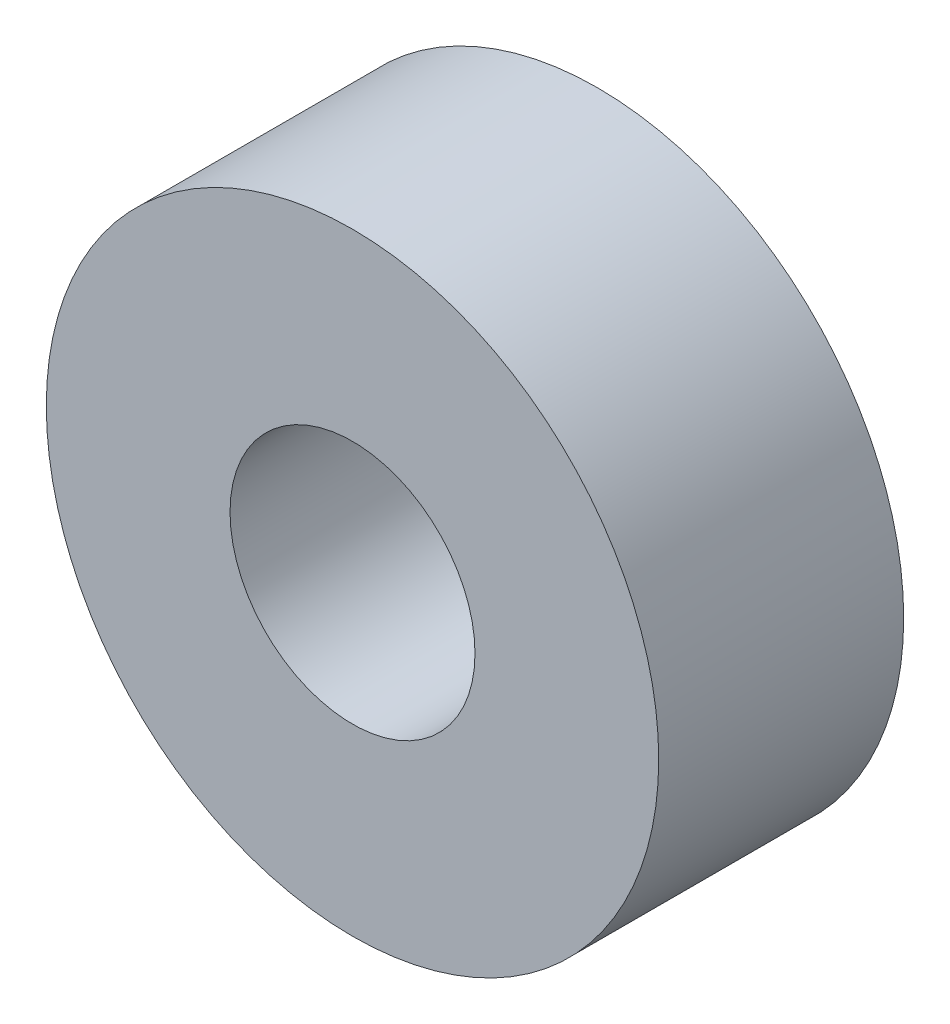
ISO-10303-21;
HEADER;
FILE_DESCRIPTION(('STEP AP214'),'2;1');
FILE_NAME('part.step','',(''),(''),'','','');
FILE_SCHEMA(('AUTOMOTIVE_DESIGN { 1 0 10303 214 1 1 1 1 }'));
ENDSEC;
DATA;
#1=APPLICATION_CONTEXT('core data for automotive mechanical design processes');
#2=APPLICATION_PROTOCOL_DEFINITION('international standard','automotive_design',2000,#1);
#3=PRODUCT_CONTEXT('',#1,'mechanical');
#4=PRODUCT('Part','Part','',(#3));
#5=PRODUCT_RELATED_PRODUCT_CATEGORY('part','',(#4));
#6=PRODUCT_DEFINITION_FORMATION('','',#4);
#7=PRODUCT_DEFINITION_CONTEXT('part definition',#1,'design');
#8=PRODUCT_DEFINITION('design','',#6,#7);
#9=PRODUCT_DEFINITION_SHAPE('','',#8);
#10=(LENGTH_UNIT() NAMED_UNIT(*) SI_UNIT(.MILLI.,.METRE.));
#11=(NAMED_UNIT(*) PLANE_ANGLE_UNIT() SI_UNIT($,.RADIAN.));
#12=(NAMED_UNIT(*) SI_UNIT($,.STERADIAN.) SOLID_ANGLE_UNIT());
#13=UNCERTAINTY_MEASURE_WITH_UNIT(LENGTH_MEASURE(1.E-05),#10,'distance_accuracy_value','');
#14=(GEOMETRIC_REPRESENTATION_CONTEXT(3) GLOBAL_UNCERTAINTY_ASSIGNED_CONTEXT((#13)) GLOBAL_UNIT_ASSIGNED_CONTEXT((#10,
#11,#12)) REPRESENTATION_CONTEXT('',''));
#15=CARTESIAN_POINT('',(0.,0.,0.));
#16=DIRECTION('',(0.,0.,1.));
#17=DIRECTION('',(1.,0.,0.));
#18=AXIS2_PLACEMENT_3D('',#15,#16,#17);
#19=CARTESIAN_POINT('',(0.,0.,4.));
#20=DIRECTION('',(0.,0.,1.));
#21=DIRECTION('',(1.,0.,0.));
#22=AXIS2_PLACEMENT_3D('',#19,#20,#21);
#23=PLANE('',#22);
#24=CARTESIAN_POINT('',(0.,0.,4.));
#25=DIRECTION('',(0.,0.,1.));
#26=DIRECTION('',(1.,0.,0.));
#27=AXIS2_PLACEMENT_3D('',#24,#25,#26);
#28=CIRCLE('',#27,5.);
#29=CARTESIAN_POINT('',(5.,0.,4.));
#30=VERTEX_POINT('',#29);
#31=EDGE_CURVE('E10',#30,#30,#28,.T.);
#32=ORIENTED_EDGE('',*,*,#31,.T.);
#33=EDGE_LOOP('',(#32));
#34=FACE_BOUND('',#33,.T.);
#35=CARTESIAN_POINT('',(0.,0.,4.));
#36=DIRECTION('',(0.,0.,1.));
#37=DIRECTION('',(1.,0.,0.));
#38=AXIS2_PLACEMENT_3D('',#35,#36,#37);
#39=CIRCLE('',#38,2.);
#40=CARTESIAN_POINT('',(2.,0.,4.));
#41=VERTEX_POINT('',#40);
#42=EDGE_CURVE('E44',#41,#41,#39,.T.);
#43=ORIENTED_EDGE('',*,*,#42,.F.);
#44=EDGE_LOOP('',(#43));
#45=FACE_BOUND('',#44,.T.);
#46=ADVANCED_FACE('F33',(#34,#45),#23,.T.);
#47=CARTESIAN_POINT('',(0.,0.,0.));
#48=DIRECTION('',(0.,0.,1.));
#49=DIRECTION('',(1.,0.,0.));
#50=AXIS2_PLACEMENT_3D('',#47,#48,#49);
#51=PLANE('',#50);
#52=CARTESIAN_POINT('',(0.,0.,0.));
#53=DIRECTION('',(0.,0.,1.));
#54=DIRECTION('',(1.,0.,0.));
#55=AXIS2_PLACEMENT_3D('',#52,#53,#54);
#56=CIRCLE('',#55,5.);
#57=CARTESIAN_POINT('',(5.,0.,0.));
#58=VERTEX_POINT('',#57);
#59=EDGE_CURVE('E37',#58,#58,#56,.T.);
#60=ORIENTED_EDGE('',*,*,#59,.F.);
#61=EDGE_LOOP('',(#60));
#62=FACE_BOUND('',#61,.T.);
#63=CARTESIAN_POINT('',(0.,0.,0.));
#64=DIRECTION('',(0.,0.,1.));
#65=DIRECTION('',(1.,0.,0.));
#66=AXIS2_PLACEMENT_3D('',#63,#64,#65);
#67=CIRCLE('',#66,2.);
#68=CARTESIAN_POINT('',(2.,0.,0.));
#69=VERTEX_POINT('',#68);
#70=EDGE_CURVE('E46',#69,#69,#67,.T.);
#71=ORIENTED_EDGE('',*,*,#70,.T.);
#72=EDGE_LOOP('',(#71));
#73=FACE_BOUND('',#72,.T.);
#74=ADVANCED_FACE('F56',(#62,#73),#51,.F.);
#75=CARTESIAN_POINT('',(0.,0.,4.));
#76=DIRECTION('',(0.,0.,-1.));
#77=DIRECTION('',(-1.,0.,0.));
#78=AXIS2_PLACEMENT_3D('',#75,#76,#77);
#79=CYLINDRICAL_SURFACE('',#78,5.);
#80=ORIENTED_EDGE('',*,*,#31,.F.);
#81=EDGE_LOOP('',(#80));
#82=FACE_BOUND('',#81,.T.);
#83=ORIENTED_EDGE('',*,*,#59,.T.);
#84=EDGE_LOOP('',(#83));
#85=FACE_BOUND('',#84,.T.);
#86=ADVANCED_FACE('F35',(#82,#85),#79,.T.);
#87=CARTESIAN_POINT('',(0.,0.,4.));
#88=DIRECTION('',(0.,0.,-1.));
#89=DIRECTION('',(-1.,0.,0.));
#90=AXIS2_PLACEMENT_3D('',#87,#88,#89);
#91=CYLINDRICAL_SURFACE('',#90,2.);
#92=ORIENTED_EDGE('',*,*,#42,.T.);
#93=EDGE_LOOP('',(#92));
#94=FACE_BOUND('',#93,.T.);
#95=ORIENTED_EDGE('',*,*,#70,.F.);
#96=EDGE_LOOP('',(#95));
#97=FACE_BOUND('',#96,.T.);
#98=ADVANCED_FACE('F52',(#94,#97),#91,.F.);
#99=CLOSED_SHELL('',(#46,#74,#86,#98));
#100=MANIFOLD_SOLID_BREP('B2',#99);
#101=ADVANCED_BREP_SHAPE_REPRESENTATION('',(#18,#100),#14);
#102=SHAPE_DEFINITION_REPRESENTATION(#9,#101);
ENDSEC;
END-ISO-10303-21;
